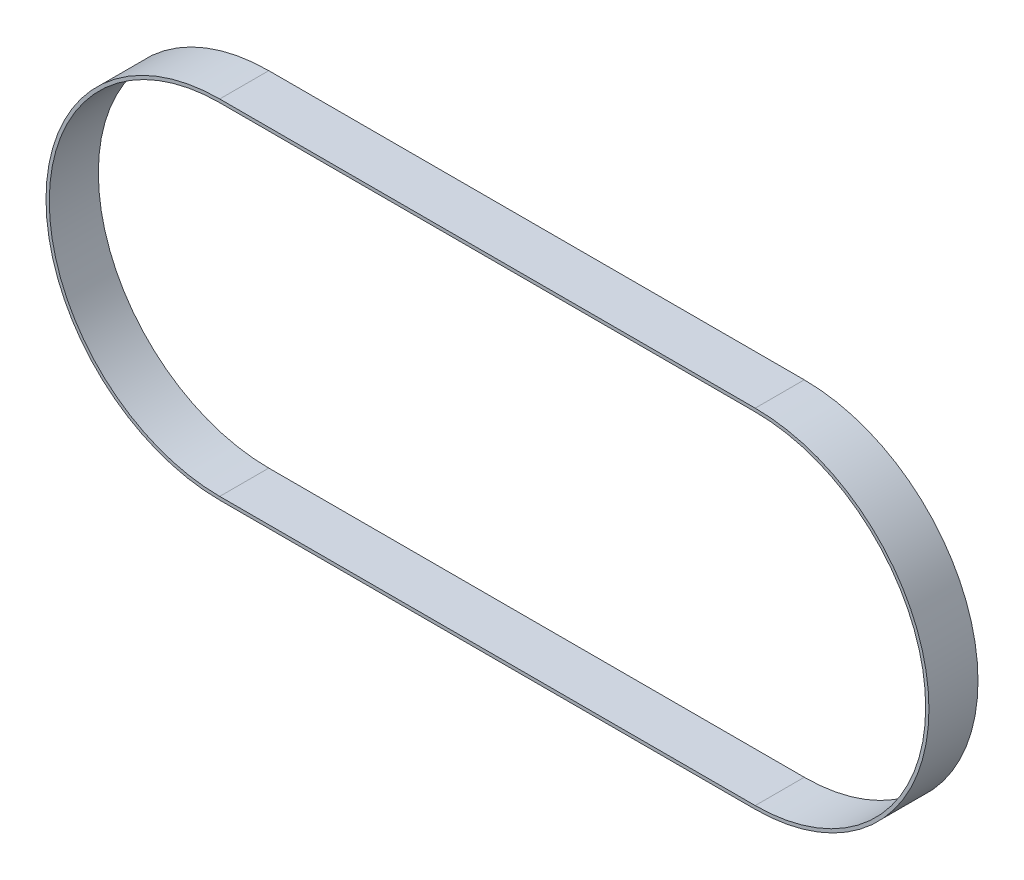
ISO-10303-21;
HEADER;
FILE_DESCRIPTION(('STEP AP214'),'2;1');
FILE_NAME('part.step','',(''),(''),'','','');
FILE_SCHEMA(('AUTOMOTIVE_DESIGN { 1 0 10303 214 1 1 1 1 }'));
ENDSEC;
DATA;
#1=APPLICATION_CONTEXT('core data for automotive mechanical design processes');
#2=APPLICATION_PROTOCOL_DEFINITION('international standard','automotive_design',2000,#1);
#3=PRODUCT_CONTEXT('',#1,'mechanical');
#4=PRODUCT('Part','Part','',(#3));
#5=PRODUCT_RELATED_PRODUCT_CATEGORY('part','',(#4));
#6=PRODUCT_DEFINITION_FORMATION('','',#4);
#7=PRODUCT_DEFINITION_CONTEXT('part definition',#1,'design');
#8=PRODUCT_DEFINITION('design','',#6,#7);
#9=PRODUCT_DEFINITION_SHAPE('','',#8);
#10=(LENGTH_UNIT() NAMED_UNIT(*) SI_UNIT(.MILLI.,.METRE.));
#11=(NAMED_UNIT(*) PLANE_ANGLE_UNIT() SI_UNIT($,.RADIAN.));
#12=(NAMED_UNIT(*) SI_UNIT($,.STERADIAN.) SOLID_ANGLE_UNIT());
#13=UNCERTAINTY_MEASURE_WITH_UNIT(LENGTH_MEASURE(1.E-05),#10,'distance_accuracy_value','');
#14=(GEOMETRIC_REPRESENTATION_CONTEXT(3) GLOBAL_UNCERTAINTY_ASSIGNED_CONTEXT((#13)) GLOBAL_UNIT_ASSIGNED_CONTEXT((#10,
#11,#12)) REPRESENTATION_CONTEXT('',''));
#15=CARTESIAN_POINT('',(0.,0.,0.));
#16=DIRECTION('',(0.,0.,1.));
#17=DIRECTION('',(1.,0.,0.));
#18=AXIS2_PLACEMENT_3D('',#15,#16,#17);
#19=CARTESIAN_POINT('',(-81.875,0.,15.));
#20=DIRECTION('',(0.,0.,1.));
#21=DIRECTION('',(1.,0.,0.));
#22=AXIS2_PLACEMENT_3D('',#19,#20,#21);
#23=PLANE('',#22);
#24=CARTESIAN_POINT('',(-81.875,0.,15.));
#25=DIRECTION('',(0.,0.,1.));
#26=DIRECTION('',(1.,0.,0.));
#27=AXIS2_PLACEMENT_3D('',#24,#25,#26);
#28=CIRCLE('',#27,53.1232438625957);
#29=CARTESIAN_POINT('',(-81.875,53.1232438625957,15.));
#30=VERTEX_POINT('',#29);
#31=CARTESIAN_POINT('',(-81.875,-53.1232438625957,15.));
#32=VERTEX_POINT('',#31);
#33=EDGE_CURVE('E135',#30,#32,#28,.T.);
#34=ORIENTED_EDGE('',*,*,#33,.T.);
#35=DIRECTION('',(1.,0.,0.));
#36=VECTOR('',#35,1.);
#37=CARTESIAN_POINT('',(-81.875,-53.1232438625957,15.));
#38=LINE('',#37,#36);
#39=CARTESIAN_POINT('',(81.875,-53.1232438625957,15.));
#40=VERTEX_POINT('',#39);
#41=EDGE_CURVE('E138',#32,#40,#38,.T.);
#42=ORIENTED_EDGE('',*,*,#41,.T.);
#43=CARTESIAN_POINT('',(81.875,0.,15.));
#44=DIRECTION('',(0.,0.,1.));
#45=DIRECTION('',(1.,0.,0.));
#46=AXIS2_PLACEMENT_3D('',#43,#44,#45);
#47=CIRCLE('',#46,53.1232438625957);
#48=CARTESIAN_POINT('',(81.875,53.1232438625957,15.));
#49=VERTEX_POINT('',#48);
#50=EDGE_CURVE('E141',#40,#49,#47,.T.);
#51=ORIENTED_EDGE('',*,*,#50,.T.);
#52=DIRECTION('',(-1.,0.,0.));
#53=VECTOR('',#52,1.);
#54=CARTESIAN_POINT('',(-81.875,53.1232438625957,15.));
#55=LINE('',#54,#53);
#56=EDGE_CURVE('E143',#49,#30,#55,.T.);
#57=ORIENTED_EDGE('',*,*,#56,.T.);
#58=EDGE_LOOP('',(#34,#42,#51,#57));
#59=FACE_BOUND('',#58,.T.);
#60=DIRECTION('',(1.,0.,0.));
#61=VECTOR('',#60,1.);
#62=CARTESIAN_POINT('',(-81.875,-52.1232438625957,15.));
#63=LINE('',#62,#61);
#64=CARTESIAN_POINT('',(-81.875,-52.1232438625957,15.));
#65=VERTEX_POINT('',#64);
#66=CARTESIAN_POINT('',(81.875,-52.1232438625957,15.));
#67=VERTEX_POINT('',#66);
#68=EDGE_CURVE('E107',#65,#67,#63,.T.);
#69=ORIENTED_EDGE('',*,*,#68,.F.);
#70=CARTESIAN_POINT('',(-81.875,0.,15.));
#71=DIRECTION('',(0.,0.,1.));
#72=DIRECTION('',(1.,0.,0.));
#73=AXIS2_PLACEMENT_3D('',#70,#71,#72);
#74=CIRCLE('',#73,52.1232438625957);
#75=CARTESIAN_POINT('',(-81.875,52.1232438625957,15.));
#76=VERTEX_POINT('',#75);
#77=EDGE_CURVE('E99',#76,#65,#74,.T.);
#78=ORIENTED_EDGE('',*,*,#77,.F.);
#79=DIRECTION('',(-1.,0.,0.));
#80=VECTOR('',#79,1.);
#81=CARTESIAN_POINT('',(-81.875,52.1232438625957,15.));
#82=LINE('',#81,#80);
#83=CARTESIAN_POINT('',(81.875,52.1232438625957,15.));
#84=VERTEX_POINT('',#83);
#85=EDGE_CURVE('E121',#84,#76,#82,.T.);
#86=ORIENTED_EDGE('',*,*,#85,.F.);
#87=CARTESIAN_POINT('',(81.875,0.,15.));
#88=DIRECTION('',(0.,0.,1.));
#89=DIRECTION('',(1.,0.,0.));
#90=AXIS2_PLACEMENT_3D('',#87,#88,#89);
#91=CIRCLE('',#90,52.1232438625957);
#92=EDGE_CURVE('E119',#67,#84,#91,.T.);
#93=ORIENTED_EDGE('',*,*,#92,.F.);
#94=EDGE_LOOP('',(#69,#78,#86,#93));
#95=FACE_BOUND('',#94,.T.);
#96=ADVANCED_FACE('F34',(#59,#95),#23,.T.);
#97=CARTESIAN_POINT('',(-81.875,0.,0.));
#98=DIRECTION('',(0.,0.,1.));
#99=DIRECTION('',(1.,0.,0.));
#100=AXIS2_PLACEMENT_3D('',#97,#98,#99);
#101=PLANE('',#100);
#102=CARTESIAN_POINT('',(-81.875,0.,0.));
#103=DIRECTION('',(0.,0.,1.));
#104=DIRECTION('',(1.,0.,0.));
#105=AXIS2_PLACEMENT_3D('',#102,#103,#104);
#106=CIRCLE('',#105,53.1232438625957);
#107=CARTESIAN_POINT('',(-81.875,53.1232438625957,0.));
#108=VERTEX_POINT('',#107);
#109=CARTESIAN_POINT('',(-81.875,-53.1232438625957,0.));
#110=VERTEX_POINT('',#109);
#111=EDGE_CURVE('E115',#108,#110,#106,.T.);
#112=ORIENTED_EDGE('',*,*,#111,.F.);
#113=DIRECTION('',(-1.,0.,0.));
#114=VECTOR('',#113,1.);
#115=CARTESIAN_POINT('',(-81.875,53.1232438625957,0.));
#116=LINE('',#115,#114);
#117=CARTESIAN_POINT('',(81.875,53.1232438625957,0.));
#118=VERTEX_POINT('',#117);
#119=EDGE_CURVE('E139',#118,#108,#116,.T.);
#120=ORIENTED_EDGE('',*,*,#119,.F.);
#121=CARTESIAN_POINT('',(81.875,0.,0.));
#122=DIRECTION('',(0.,0.,1.));
#123=DIRECTION('',(1.,0.,0.));
#124=AXIS2_PLACEMENT_3D('',#121,#122,#123);
#125=CIRCLE('',#124,53.1232438625957);
#126=CARTESIAN_POINT('',(81.875,-53.1232438625957,0.));
#127=VERTEX_POINT('',#126);
#128=EDGE_CURVE('E150',#127,#118,#125,.T.);
#129=ORIENTED_EDGE('',*,*,#128,.F.);
#130=DIRECTION('',(1.,0.,0.));
#131=VECTOR('',#130,1.);
#132=CARTESIAN_POINT('',(-81.875,-53.1232438625957,0.));
#133=LINE('',#132,#131);
#134=EDGE_CURVE('E148',#110,#127,#133,.T.);
#135=ORIENTED_EDGE('',*,*,#134,.F.);
#136=EDGE_LOOP('',(#112,#120,#129,#135));
#137=FACE_BOUND('',#136,.T.);
#138=CARTESIAN_POINT('',(-81.875,0.,0.));
#139=DIRECTION('',(0.,0.,1.));
#140=DIRECTION('',(1.,0.,0.));
#141=AXIS2_PLACEMENT_3D('',#138,#139,#140);
#142=CIRCLE('',#141,52.1232438625957);
#143=CARTESIAN_POINT('',(-81.875,52.1232438625957,0.));
#144=VERTEX_POINT('',#143);
#145=CARTESIAN_POINT('',(-81.875,-52.1232438625957,0.));
#146=VERTEX_POINT('',#145);
#147=EDGE_CURVE('E57',#144,#146,#142,.T.);
#148=ORIENTED_EDGE('',*,*,#147,.T.);
#149=DIRECTION('',(1.,0.,0.));
#150=VECTOR('',#149,1.);
#151=CARTESIAN_POINT('',(-81.875,-52.1232438625957,0.));
#152=LINE('',#151,#150);
#153=CARTESIAN_POINT('',(81.875,-52.1232438625957,0.));
#154=VERTEX_POINT('',#153);
#155=EDGE_CURVE('E114',#146,#154,#152,.T.);
#156=ORIENTED_EDGE('',*,*,#155,.T.);
#157=CARTESIAN_POINT('',(81.875,0.,0.));
#158=DIRECTION('',(0.,0.,1.));
#159=DIRECTION('',(1.,0.,0.));
#160=AXIS2_PLACEMENT_3D('',#157,#158,#159);
#161=CIRCLE('',#160,52.1232438625957);
#162=CARTESIAN_POINT('',(81.875,52.1232438625957,0.));
#163=VERTEX_POINT('',#162);
#164=EDGE_CURVE('E127',#154,#163,#161,.T.);
#165=ORIENTED_EDGE('',*,*,#164,.T.);
#166=DIRECTION('',(-1.,0.,0.));
#167=VECTOR('',#166,1.);
#168=CARTESIAN_POINT('',(-81.875,52.1232438625957,0.));
#169=LINE('',#168,#167);
#170=EDGE_CURVE('E108',#163,#144,#169,.T.);
#171=ORIENTED_EDGE('',*,*,#170,.T.);
#172=EDGE_LOOP('',(#148,#156,#165,#171));
#173=FACE_BOUND('',#172,.T.);
#174=ADVANCED_FACE('F168',(#137,#173),#101,.F.);
#175=CARTESIAN_POINT('',(-81.875,0.,15.));
#176=DIRECTION('',(0.,0.,-1.));
#177=DIRECTION('',(-1.,0.,0.));
#178=AXIS2_PLACEMENT_3D('',#175,#176,#177);
#179=CYLINDRICAL_SURFACE('',#178,53.1232438625957);
#180=ORIENTED_EDGE('',*,*,#111,.T.);
#181=DIRECTION('',(0.,0.,-1.));
#182=VECTOR('',#181,1.);
#183=CARTESIAN_POINT('',(-81.875,-53.1232438625957,15.));
#184=LINE('',#183,#182);
#185=EDGE_CURVE('E11',#32,#110,#184,.T.);
#186=ORIENTED_EDGE('',*,*,#185,.F.);
#187=ORIENTED_EDGE('',*,*,#33,.F.);
#188=DIRECTION('',(0.,0.,-1.));
#189=VECTOR('',#188,1.);
#190=CARTESIAN_POINT('',(-81.875,53.1232438625957,15.));
#191=LINE('',#190,#189);
#192=EDGE_CURVE('E145',#30,#108,#191,.T.);
#193=ORIENTED_EDGE('',*,*,#192,.T.);
#194=EDGE_LOOP('',(#180,#186,#187,#193));
#195=FACE_BOUND('',#194,.T.);
#196=ADVANCED_FACE('F36',(#195),#179,.T.);
#197=CARTESIAN_POINT('',(-81.875,-53.1232438625957,15.));
#198=DIRECTION('',(0.,1.,0.));
#199=DIRECTION('',(-1.,0.,0.));
#200=AXIS2_PLACEMENT_3D('',#197,#198,#199);
#201=PLANE('',#200);
#202=ORIENTED_EDGE('',*,*,#134,.T.);
#203=DIRECTION('',(0.,0.,-1.));
#204=VECTOR('',#203,1.);
#205=CARTESIAN_POINT('',(81.875,-53.1232438625957,15.));
#206=LINE('',#205,#204);
#207=EDGE_CURVE('E42',#40,#127,#206,.T.);
#208=ORIENTED_EDGE('',*,*,#207,.F.);
#209=ORIENTED_EDGE('',*,*,#41,.F.);
#210=ORIENTED_EDGE('',*,*,#185,.T.);
#211=EDGE_LOOP('',(#202,#208,#209,#210));
#212=FACE_BOUND('',#211,.T.);
#213=ADVANCED_FACE('F178',(#212),#201,.F.);
#214=CARTESIAN_POINT('',(81.875,0.,15.));
#215=DIRECTION('',(0.,0.,-1.));
#216=DIRECTION('',(-1.,0.,0.));
#217=AXIS2_PLACEMENT_3D('',#214,#215,#216);
#218=CYLINDRICAL_SURFACE('',#217,53.1232438625957);
#219=ORIENTED_EDGE('',*,*,#128,.T.);
#220=DIRECTION('',(0.,0.,-1.));
#221=VECTOR('',#220,1.);
#222=CARTESIAN_POINT('',(81.875,53.1232438625957,15.));
#223=LINE('',#222,#221);
#224=EDGE_CURVE('E155',#49,#118,#223,.T.);
#225=ORIENTED_EDGE('',*,*,#224,.F.);
#226=ORIENTED_EDGE('',*,*,#50,.F.);
#227=ORIENTED_EDGE('',*,*,#207,.T.);
#228=EDGE_LOOP('',(#219,#225,#226,#227));
#229=FACE_BOUND('',#228,.T.);
#230=ADVANCED_FACE('F162',(#229),#218,.T.);
#231=CARTESIAN_POINT('',(-81.875,53.1232438625957,15.));
#232=DIRECTION('',(0.,-1.,0.));
#233=DIRECTION('',(1.,0.,0.));
#234=AXIS2_PLACEMENT_3D('',#231,#232,#233);
#235=PLANE('',#234);
#236=ORIENTED_EDGE('',*,*,#119,.T.);
#237=ORIENTED_EDGE('',*,*,#192,.F.);
#238=ORIENTED_EDGE('',*,*,#56,.F.);
#239=ORIENTED_EDGE('',*,*,#224,.T.);
#240=EDGE_LOOP('',(#236,#237,#238,#239));
#241=FACE_BOUND('',#240,.T.);
#242=ADVANCED_FACE('F172',(#241),#235,.F.);
#243=CARTESIAN_POINT('',(-81.875,0.,15.));
#244=DIRECTION('',(0.,0.,-1.));
#245=DIRECTION('',(-1.,0.,0.));
#246=AXIS2_PLACEMENT_3D('',#243,#244,#245);
#247=CYLINDRICAL_SURFACE('',#246,52.1232438625957);
#248=ORIENTED_EDGE('',*,*,#147,.F.);
#249=DIRECTION('',(0.,0.,-1.));
#250=VECTOR('',#249,1.);
#251=CARTESIAN_POINT('',(-81.875,52.1232438625957,15.));
#252=LINE('',#251,#250);
#253=EDGE_CURVE('E103',#76,#144,#252,.T.);
#254=ORIENTED_EDGE('',*,*,#253,.F.);
#255=ORIENTED_EDGE('',*,*,#77,.T.);
#256=DIRECTION('',(0.,0.,-1.));
#257=VECTOR('',#256,1.);
#258=CARTESIAN_POINT('',(-81.875,-52.1232438625957,15.));
#259=LINE('',#258,#257);
#260=EDGE_CURVE('E102',#65,#146,#259,.T.);
#261=ORIENTED_EDGE('',*,*,#260,.T.);
#262=EDGE_LOOP('',(#248,#254,#255,#261));
#263=FACE_BOUND('',#262,.T.);
#264=ADVANCED_FACE('F101',(#263),#247,.F.);
#265=CARTESIAN_POINT('',(-81.875,-52.1232438625957,15.));
#266=DIRECTION('',(0.,1.,0.));
#267=DIRECTION('',(0.,0.,1.));
#268=AXIS2_PLACEMENT_3D('',#265,#266,#267);
#269=PLANE('',#268);
#270=ORIENTED_EDGE('',*,*,#155,.F.);
#271=ORIENTED_EDGE('',*,*,#260,.F.);
#272=ORIENTED_EDGE('',*,*,#68,.T.);
#273=DIRECTION('',(0.,0.,-1.));
#274=VECTOR('',#273,1.);
#275=CARTESIAN_POINT('',(81.875,-52.1232438625957,15.));
#276=LINE('',#275,#274);
#277=EDGE_CURVE('E116',#67,#154,#276,.T.);
#278=ORIENTED_EDGE('',*,*,#277,.T.);
#279=EDGE_LOOP('',(#270,#271,#272,#278));
#280=FACE_BOUND('',#279,.T.);
#281=ADVANCED_FACE('F111',(#280),#269,.T.);
#282=CARTESIAN_POINT('',(81.875,0.,15.));
#283=DIRECTION('',(0.,0.,-1.));
#284=DIRECTION('',(-1.,0.,0.));
#285=AXIS2_PLACEMENT_3D('',#282,#283,#284);
#286=CYLINDRICAL_SURFACE('',#285,52.1232438625957);
#287=ORIENTED_EDGE('',*,*,#164,.F.);
#288=ORIENTED_EDGE('',*,*,#277,.F.);
#289=ORIENTED_EDGE('',*,*,#92,.T.);
#290=DIRECTION('',(0.,0.,-1.));
#291=VECTOR('',#290,1.);
#292=CARTESIAN_POINT('',(81.875,52.1232438625957,15.));
#293=LINE('',#292,#291);
#294=EDGE_CURVE('E49',#84,#163,#293,.T.);
#295=ORIENTED_EDGE('',*,*,#294,.T.);
#296=EDGE_LOOP('',(#287,#288,#289,#295));
#297=FACE_BOUND('',#296,.T.);
#298=ADVANCED_FACE('F201',(#297),#286,.F.);
#299=CARTESIAN_POINT('',(-81.875,52.1232438625957,15.));
#300=DIRECTION('',(0.,-1.,0.));
#301=DIRECTION('',(1.,0.,0.));
#302=AXIS2_PLACEMENT_3D('',#299,#300,#301);
#303=PLANE('',#302);
#304=ORIENTED_EDGE('',*,*,#170,.F.);
#305=ORIENTED_EDGE('',*,*,#294,.F.);
#306=ORIENTED_EDGE('',*,*,#85,.T.);
#307=ORIENTED_EDGE('',*,*,#253,.T.);
#308=EDGE_LOOP('',(#304,#305,#306,#307));
#309=FACE_BOUND('',#308,.T.);
#310=ADVANCED_FACE('F205',(#309),#303,.T.);
#311=CLOSED_SHELL('',(#96,#174,#196,#213,#230,#242,#264,#281,#298,#310));
#312=MANIFOLD_SOLID_BREP('B2',#311);
#313=ADVANCED_BREP_SHAPE_REPRESENTATION('',(#18,#312),#14);
#314=SHAPE_DEFINITION_REPRESENTATION(#9,#313);
ENDSEC;
END-ISO-10303-21;
